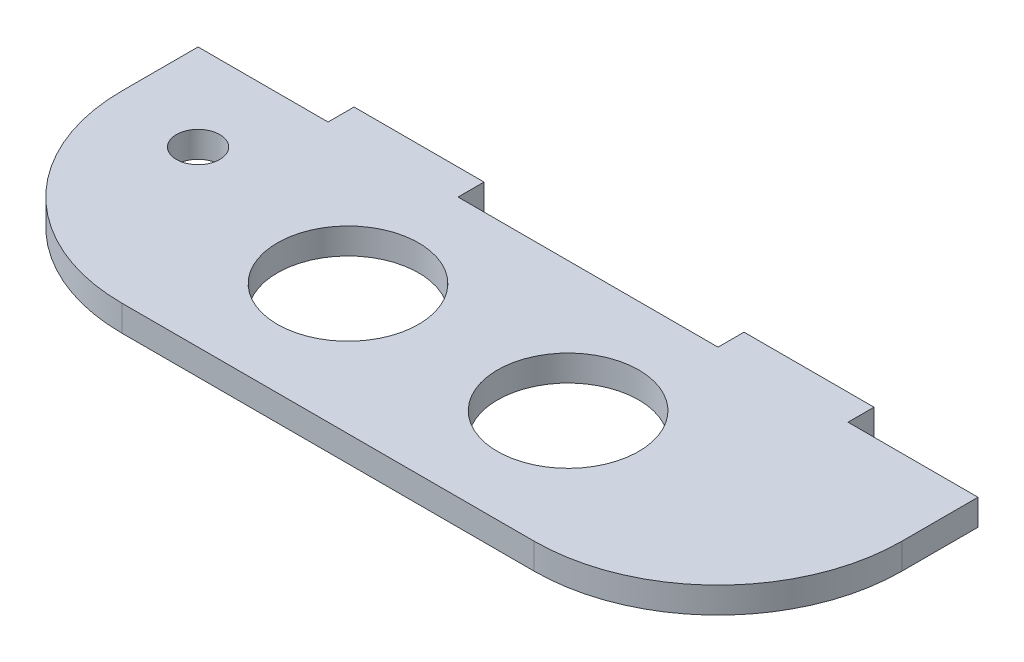
ISO-10303-21;
HEADER;
FILE_DESCRIPTION(('STEP AP214'),'2;1');
FILE_NAME('part.step','',(''),(''),'','','');
FILE_SCHEMA(('AUTOMOTIVE_DESIGN { 1 0 10303 214 1 1 1 1 }'));
ENDSEC;
DATA;
#1=APPLICATION_CONTEXT('core data for automotive mechanical design processes');
#2=APPLICATION_PROTOCOL_DEFINITION('international standard','automotive_design',2000,#1);
#3=PRODUCT_CONTEXT('',#1,'mechanical');
#4=PRODUCT('Part','Part','',(#3));
#5=PRODUCT_RELATED_PRODUCT_CATEGORY('part','',(#4));
#6=PRODUCT_DEFINITION_FORMATION('','',#4);
#7=PRODUCT_DEFINITION_CONTEXT('part definition',#1,'design');
#8=PRODUCT_DEFINITION('design','',#6,#7);
#9=PRODUCT_DEFINITION_SHAPE('','',#8);
#10=(LENGTH_UNIT() NAMED_UNIT(*) SI_UNIT(.MILLI.,.METRE.));
#11=(NAMED_UNIT(*) PLANE_ANGLE_UNIT() SI_UNIT($,.RADIAN.));
#12=(NAMED_UNIT(*) SI_UNIT($,.STERADIAN.) SOLID_ANGLE_UNIT());
#13=UNCERTAINTY_MEASURE_WITH_UNIT(LENGTH_MEASURE(1.E-05),#10,'distance_accuracy_value','');
#14=(GEOMETRIC_REPRESENTATION_CONTEXT(3) GLOBAL_UNCERTAINTY_ASSIGNED_CONTEXT((#13)) GLOBAL_UNIT_ASSIGNED_CONTEXT((#10,
#11,#12)) REPRESENTATION_CONTEXT('',''));
#15=CARTESIAN_POINT('',(0.,0.,0.));
#16=DIRECTION('',(0.,0.,1.));
#17=DIRECTION('',(1.,0.,0.));
#18=AXIS2_PLACEMENT_3D('',#15,#16,#17);
#19=CARTESIAN_POINT('',(-45.,3.,15.));
#20=DIRECTION('',(0.,0.,-1.));
#21=DIRECTION('',(-1.,0.,0.));
#22=AXIS2_PLACEMENT_3D('',#19,#20,#21);
#23=PLANE('',#22);
#24=DIRECTION('',(0.,1.,0.));
#25=VECTOR('',#24,1.);
#26=CARTESIAN_POINT('',(-23.7867965644036,-7.,15.));
#27=LINE('',#26,#25);
#28=CARTESIAN_POINT('',(-23.7867965644036,0.,15.));
#29=VERTEX_POINT('',#28);
#30=CARTESIAN_POINT('',(-23.7867965644036,3.,15.));
#31=VERTEX_POINT('',#30);
#32=EDGE_CURVE('E147',#29,#31,#27,.T.);
#33=ORIENTED_EDGE('',*,*,#32,.F.);
#34=DIRECTION('',(1.,0.,0.));
#35=VECTOR('',#34,1.);
#36=CARTESIAN_POINT('',(-45.,0.,15.));
#37=LINE('',#36,#35);
#38=CARTESIAN_POINT('',(23.7867965644036,0.,15.));
#39=VERTEX_POINT('',#38);
#40=EDGE_CURVE('E198',#29,#39,#37,.T.);
#41=ORIENTED_EDGE('',*,*,#40,.T.);
#42=DIRECTION('',(0.,1.,0.));
#43=VECTOR('',#42,1.);
#44=CARTESIAN_POINT('',(23.7867965644035,-7.,15.));
#45=LINE('',#44,#43);
#46=CARTESIAN_POINT('',(23.7867965644035,3.,15.));
#47=VERTEX_POINT('',#46);
#48=EDGE_CURVE('E68',#39,#47,#45,.T.);
#49=ORIENTED_EDGE('',*,*,#48,.T.);
#50=DIRECTION('',(1.,0.,0.));
#51=VECTOR('',#50,1.);
#52=CARTESIAN_POINT('',(-45.,3.,15.));
#53=LINE('',#52,#51);
#54=EDGE_CURVE('E167',#31,#47,#53,.T.);
#55=ORIENTED_EDGE('',*,*,#54,.F.);
#56=EDGE_LOOP('',(#33,#41,#49,#55));
#57=FACE_BOUND('',#56,.T.);
#58=ADVANCED_FACE('F46',(#57),#23,.F.);
#59=CARTESIAN_POINT('',(0.,3.,0.));
#60=DIRECTION('',(0.,-1.,0.));
#61=DIRECTION('',(0.,0.,-1.));
#62=AXIS2_PLACEMENT_3D('',#59,#60,#61);
#63=PLANE('',#62);
#64=CARTESIAN_POINT('',(-23.7867965644036,3.,-6.21320343559642));
#65=DIRECTION('',(0.,1.,0.));
#66=DIRECTION('',(0.,0.,1.));
#67=AXIS2_PLACEMENT_3D('',#64,#65,#66);
#68=CIRCLE('',#67,21.2132034355964);
#69=CARTESIAN_POINT('',(-45.,3.,-6.21320343559642));
#70=VERTEX_POINT('',#69);
#71=EDGE_CURVE('E144',#70,#31,#68,.T.);
#72=ORIENTED_EDGE('',*,*,#71,.T.);
#73=ORIENTED_EDGE('',*,*,#54,.T.);
#74=CARTESIAN_POINT('',(23.7867965644036,3.,-6.2132034355964));
#75=DIRECTION('',(0.,1.,0.));
#76=DIRECTION('',(0.,0.,1.));
#77=AXIS2_PLACEMENT_3D('',#74,#75,#76);
#78=CIRCLE('',#77,21.2132034355964);
#79=CARTESIAN_POINT('',(45.,3.,-6.21320343559638));
#80=VERTEX_POINT('',#79);
#81=EDGE_CURVE('E247',#80,#47,#78,.F.);
#82=ORIENTED_EDGE('',*,*,#81,.F.);
#83=DIRECTION('',(0.,0.,-1.));
#84=VECTOR('',#83,1.);
#85=CARTESIAN_POINT('',(45.,3.,15.));
#86=LINE('',#85,#84);
#87=CARTESIAN_POINT('',(45.,3.,-15.));
#88=VERTEX_POINT('',#87);
#89=EDGE_CURVE('E169',#80,#88,#86,.T.);
#90=ORIENTED_EDGE('',*,*,#89,.T.);
#91=DIRECTION('',(-1.,0.,0.));
#92=VECTOR('',#91,1.);
#93=CARTESIAN_POINT('',(45.,3.,-15.));
#94=LINE('',#93,#92);
#95=CARTESIAN_POINT('',(30.,3.,-15.));
#96=VERTEX_POINT('',#95);
#97=EDGE_CURVE('E203',#88,#96,#94,.T.);
#98=ORIENTED_EDGE('',*,*,#97,.T.);
#99=DIRECTION('',(0.,0.,-1.));
#100=VECTOR('',#99,1.);
#101=CARTESIAN_POINT('',(30.,3.,-15.));
#102=LINE('',#101,#100);
#103=CARTESIAN_POINT('',(30.,3.,-18.));
#104=VERTEX_POINT('',#103);
#105=EDGE_CURVE('E256',#96,#104,#102,.T.);
#106=ORIENTED_EDGE('',*,*,#105,.T.);
#107=DIRECTION('',(-1.,0.,0.));
#108=VECTOR('',#107,1.);
#109=CARTESIAN_POINT('',(30.,3.,-18.));
#110=LINE('',#109,#108);
#111=CARTESIAN_POINT('',(15.,3.,-18.));
#112=VERTEX_POINT('',#111);
#113=EDGE_CURVE('E258',#104,#112,#110,.T.);
#114=ORIENTED_EDGE('',*,*,#113,.T.);
#115=DIRECTION('',(0.,0.,1.));
#116=VECTOR('',#115,1.);
#117=CARTESIAN_POINT('',(15.,3.,-18.));
#118=LINE('',#117,#116);
#119=CARTESIAN_POINT('',(15.,3.,-15.));
#120=VERTEX_POINT('',#119);
#121=EDGE_CURVE('E264',#112,#120,#118,.T.);
#122=ORIENTED_EDGE('',*,*,#121,.T.);
#123=DIRECTION('',(-1.,0.,0.));
#124=VECTOR('',#123,1.);
#125=CARTESIAN_POINT('',(-15.,3.,-15.));
#126=LINE('',#125,#124);
#127=CARTESIAN_POINT('',(-15.,3.,-15.));
#128=VERTEX_POINT('',#127);
#129=EDGE_CURVE('E266',#120,#128,#126,.T.);
#130=ORIENTED_EDGE('',*,*,#129,.T.);
#131=DIRECTION('',(0.,0.,-1.));
#132=VECTOR('',#131,1.);
#133=CARTESIAN_POINT('',(-15.,3.,-18.));
#134=LINE('',#133,#132);
#135=CARTESIAN_POINT('',(-15.,3.,-18.));
#136=VERTEX_POINT('',#135);
#137=EDGE_CURVE('E268',#128,#136,#134,.T.);
#138=ORIENTED_EDGE('',*,*,#137,.T.);
#139=DIRECTION('',(-1.,0.,0.));
#140=VECTOR('',#139,1.);
#141=CARTESIAN_POINT('',(-30.,3.,-18.));
#142=LINE('',#141,#140);
#143=CARTESIAN_POINT('',(-30.,3.,-18.));
#144=VERTEX_POINT('',#143);
#145=EDGE_CURVE('E270',#136,#144,#142,.T.);
#146=ORIENTED_EDGE('',*,*,#145,.T.);
#147=DIRECTION('',(0.,0.,1.));
#148=VECTOR('',#147,1.);
#149=CARTESIAN_POINT('',(-30.,3.,-15.));
#150=LINE('',#149,#148);
#151=CARTESIAN_POINT('',(-30.,3.,-15.));
#152=VERTEX_POINT('',#151);
#153=EDGE_CURVE('E171',#144,#152,#150,.T.);
#154=ORIENTED_EDGE('',*,*,#153,.T.);
#155=DIRECTION('',(-1.,0.,0.));
#156=VECTOR('',#155,1.);
#157=CARTESIAN_POINT('',(-45.,3.,-15.));
#158=LINE('',#157,#156);
#159=CARTESIAN_POINT('',(-45.,3.,-15.));
#160=VERTEX_POINT('',#159);
#161=EDGE_CURVE('E165',#152,#160,#158,.T.);
#162=ORIENTED_EDGE('',*,*,#161,.T.);
#163=DIRECTION('',(0.,0.,1.));
#164=VECTOR('',#163,1.);
#165=CARTESIAN_POINT('',(-45.,3.,15.));
#166=LINE('',#165,#164);
#167=EDGE_CURVE('E158',#160,#70,#166,.T.);
#168=ORIENTED_EDGE('',*,*,#167,.T.);
#169=EDGE_LOOP('',(#72,#73,#82,#90,#98,#106,#114,#122,#130,#138,#146,#154,#162,#168));
#170=FACE_BOUND('',#169,.T.);
#171=CARTESIAN_POINT('',(-35.,3.,-4.99999999999999));
#172=DIRECTION('',(0.,1.,0.));
#173=DIRECTION('',(0.,0.,1.));
#174=AXIS2_PLACEMENT_3D('',#171,#172,#173);
#175=CIRCLE('',#174,2.5);
#176=CARTESIAN_POINT('',(-35.,3.,-2.49999999999999));
#177=VERTEX_POINT('',#176);
#178=EDGE_CURVE('E235',#177,#177,#175,.T.);
#179=ORIENTED_EDGE('',*,*,#178,.F.);
#180=EDGE_LOOP('',(#179));
#181=FACE_BOUND('',#180,.T.);
#182=CARTESIAN_POINT('',(-12.7,3.,0.));
#183=DIRECTION('',(0.,1.,0.));
#184=DIRECTION('',(0.,0.,1.));
#185=AXIS2_PLACEMENT_3D('',#182,#183,#184);
#186=CIRCLE('',#185,8.15);
#187=CARTESIAN_POINT('',(-12.7,3.,8.15));
#188=VERTEX_POINT('',#187);
#189=EDGE_CURVE('E181',#188,#188,#186,.T.);
#190=ORIENTED_EDGE('',*,*,#189,.F.);
#191=EDGE_LOOP('',(#190));
#192=FACE_BOUND('',#191,.T.);
#193=CARTESIAN_POINT('',(12.7,3.,0.));
#194=DIRECTION('',(0.,1.,0.));
#195=DIRECTION('',(0.,0.,-1.));
#196=AXIS2_PLACEMENT_3D('',#193,#194,#195);
#197=CIRCLE('',#196,8.15);
#198=CARTESIAN_POINT('',(12.7,3.,-8.14999999999995));
#199=VERTEX_POINT('',#198);
#200=EDGE_CURVE('E292',#199,#199,#197,.T.);
#201=ORIENTED_EDGE('',*,*,#200,.F.);
#202=EDGE_LOOP('',(#201));
#203=FACE_BOUND('',#202,.T.);
#204=ADVANCED_FACE('F162',(#170,#181,#192,#203),#63,.F.);
#205=CARTESIAN_POINT('',(0.,0.,0.));
#206=DIRECTION('',(0.,-1.,0.));
#207=DIRECTION('',(0.,0.,-1.));
#208=AXIS2_PLACEMENT_3D('',#205,#206,#207);
#209=PLANE('',#208);
#210=CARTESIAN_POINT('',(12.7,0.,0.));
#211=DIRECTION('',(0.,1.,0.));
#212=DIRECTION('',(0.,0.,-1.));
#213=AXIS2_PLACEMENT_3D('',#210,#211,#212);
#214=CIRCLE('',#213,8.15);
#215=CARTESIAN_POINT('',(12.7,0.,-8.14999999999995));
#216=VERTEX_POINT('',#215);
#217=EDGE_CURVE('E234',#216,#216,#214,.T.);
#218=ORIENTED_EDGE('',*,*,#217,.T.);
#219=EDGE_LOOP('',(#218));
#220=FACE_BOUND('',#219,.T.);
#221=CARTESIAN_POINT('',(-12.7,0.,0.));
#222=DIRECTION('',(0.,1.,0.));
#223=DIRECTION('',(0.,0.,1.));
#224=AXIS2_PLACEMENT_3D('',#221,#222,#223);
#225=CIRCLE('',#224,8.15);
#226=CARTESIAN_POINT('',(-12.7,0.,8.15));
#227=VERTEX_POINT('',#226);
#228=EDGE_CURVE('E290',#227,#227,#225,.T.);
#229=ORIENTED_EDGE('',*,*,#228,.T.);
#230=EDGE_LOOP('',(#229));
#231=FACE_BOUND('',#230,.T.);
#232=CARTESIAN_POINT('',(-35.,0.,-4.99999999999999));
#233=DIRECTION('',(0.,-1.,0.));
#234=DIRECTION('',(0.,0.,-1.));
#235=AXIS2_PLACEMENT_3D('',#232,#233,#234);
#236=CIRCLE('',#235,2.5);
#237=CARTESIAN_POINT('',(-35.,0.,-7.5));
#238=VERTEX_POINT('',#237);
#239=EDGE_CURVE('E232',#238,#238,#236,.T.);
#240=ORIENTED_EDGE('',*,*,#239,.F.);
#241=EDGE_LOOP('',(#240));
#242=FACE_BOUND('',#241,.T.);
#243=ORIENTED_EDGE('',*,*,#40,.F.);
#244=CARTESIAN_POINT('',(-23.7867965644036,0.,-6.21320343559642));
#245=DIRECTION('',(0.,-1.,0.));
#246=DIRECTION('',(0.,0.,-1.));
#247=AXIS2_PLACEMENT_3D('',#244,#245,#246);
#248=CIRCLE('',#247,21.2132034355964);
#249=CARTESIAN_POINT('',(-45.,0.,-6.21320343559642));
#250=VERTEX_POINT('',#249);
#251=EDGE_CURVE('E13',#29,#250,#248,.T.);
#252=ORIENTED_EDGE('',*,*,#251,.T.);
#253=DIRECTION('',(0.,0.,1.));
#254=VECTOR('',#253,1.);
#255=CARTESIAN_POINT('',(-45.,0.,15.));
#256=LINE('',#255,#254);
#257=CARTESIAN_POINT('',(-45.,0.,-15.));
#258=VERTEX_POINT('',#257);
#259=EDGE_CURVE('E160',#258,#250,#256,.T.);
#260=ORIENTED_EDGE('',*,*,#259,.F.);
#261=DIRECTION('',(-1.,0.,0.));
#262=VECTOR('',#261,1.);
#263=CARTESIAN_POINT('',(-45.,0.,-15.));
#264=LINE('',#263,#262);
#265=CARTESIAN_POINT('',(-30.,0.,-15.));
#266=VERTEX_POINT('',#265);
#267=EDGE_CURVE('E195',#266,#258,#264,.T.);
#268=ORIENTED_EDGE('',*,*,#267,.F.);
#269=DIRECTION('',(0.,0.,1.));
#270=VECTOR('',#269,1.);
#271=CARTESIAN_POINT('',(-30.,0.,-15.));
#272=LINE('',#271,#270);
#273=CARTESIAN_POINT('',(-30.,0.,-18.));
#274=VERTEX_POINT('',#273);
#275=EDGE_CURVE('E193',#274,#266,#272,.T.);
#276=ORIENTED_EDGE('',*,*,#275,.F.);
#277=DIRECTION('',(-1.,0.,0.));
#278=VECTOR('',#277,1.);
#279=CARTESIAN_POINT('',(-30.,0.,-18.));
#280=LINE('',#279,#278);
#281=CARTESIAN_POINT('',(-15.,0.,-18.));
#282=VERTEX_POINT('',#281);
#283=EDGE_CURVE('E191',#282,#274,#280,.T.);
#284=ORIENTED_EDGE('',*,*,#283,.F.);
#285=DIRECTION('',(0.,0.,-1.));
#286=VECTOR('',#285,1.);
#287=CARTESIAN_POINT('',(-15.,0.,-18.));
#288=LINE('',#287,#286);
#289=CARTESIAN_POINT('',(-15.,0.,-15.));
#290=VERTEX_POINT('',#289);
#291=EDGE_CURVE('E189',#290,#282,#288,.T.);
#292=ORIENTED_EDGE('',*,*,#291,.F.);
#293=DIRECTION('',(-1.,0.,0.));
#294=VECTOR('',#293,1.);
#295=CARTESIAN_POINT('',(-15.,0.,-15.));
#296=LINE('',#295,#294);
#297=CARTESIAN_POINT('',(15.,0.,-15.));
#298=VERTEX_POINT('',#297);
#299=EDGE_CURVE('E187',#298,#290,#296,.T.);
#300=ORIENTED_EDGE('',*,*,#299,.F.);
#301=DIRECTION('',(0.,0.,1.));
#302=VECTOR('',#301,1.);
#303=CARTESIAN_POINT('',(15.,0.,-18.));
#304=LINE('',#303,#302);
#305=CARTESIAN_POINT('',(15.,0.,-18.));
#306=VERTEX_POINT('',#305);
#307=EDGE_CURVE('E185',#306,#298,#304,.T.);
#308=ORIENTED_EDGE('',*,*,#307,.F.);
#309=DIRECTION('',(-1.,0.,0.));
#310=VECTOR('',#309,1.);
#311=CARTESIAN_POINT('',(30.,0.,-18.));
#312=LINE('',#311,#310);
#313=CARTESIAN_POINT('',(30.,0.,-18.));
#314=VERTEX_POINT('',#313);
#315=EDGE_CURVE('E183',#314,#306,#312,.T.);
#316=ORIENTED_EDGE('',*,*,#315,.F.);
#317=DIRECTION('',(0.,0.,-1.));
#318=VECTOR('',#317,1.);
#319=CARTESIAN_POINT('',(30.,0.,-15.));
#320=LINE('',#319,#318);
#321=CARTESIAN_POINT('',(30.,0.,-15.));
#322=VERTEX_POINT('',#321);
#323=EDGE_CURVE('E180',#322,#314,#320,.T.);
#324=ORIENTED_EDGE('',*,*,#323,.F.);
#325=DIRECTION('',(-1.,0.,0.));
#326=VECTOR('',#325,1.);
#327=CARTESIAN_POINT('',(45.,0.,-15.));
#328=LINE('',#327,#326);
#329=CARTESIAN_POINT('',(45.,0.,-15.));
#330=VERTEX_POINT('',#329);
#331=EDGE_CURVE('E177',#330,#322,#328,.T.);
#332=ORIENTED_EDGE('',*,*,#331,.F.);
#333=DIRECTION('',(0.,0.,-1.));
#334=VECTOR('',#333,1.);
#335=CARTESIAN_POINT('',(45.,0.,15.));
#336=LINE('',#335,#334);
#337=CARTESIAN_POINT('',(45.,0.,-6.21320343559638));
#338=VERTEX_POINT('',#337);
#339=EDGE_CURVE('E201',#338,#330,#336,.T.);
#340=ORIENTED_EDGE('',*,*,#339,.F.);
#341=CARTESIAN_POINT('',(23.7867965644036,0.,-6.2132034355964));
#342=DIRECTION('',(0.,-1.,0.));
#343=DIRECTION('',(0.,0.,-1.));
#344=AXIS2_PLACEMENT_3D('',#341,#342,#343);
#345=CIRCLE('',#344,21.2132034355964);
#346=EDGE_CURVE('E54',#39,#338,#345,.F.);
#347=ORIENTED_EDGE('',*,*,#346,.F.);
#348=EDGE_LOOP('',(#243,#252,#260,#268,#276,#284,#292,#300,#308,#316,#324,#332,#340,#347));
#349=FACE_BOUND('',#348,.T.);
#350=ADVANCED_FACE('F250',(#220,#231,#242,#349),#209,.T.);
#351=CARTESIAN_POINT('',(45.,3.,-15.));
#352=DIRECTION('',(0.,0.,1.));
#353=DIRECTION('',(1.,0.,0.));
#354=AXIS2_PLACEMENT_3D('',#351,#352,#353);
#355=PLANE('',#354);
#356=ORIENTED_EDGE('',*,*,#331,.T.);
#357=DIRECTION('',(0.,-1.,0.));
#358=VECTOR('',#357,1.);
#359=CARTESIAN_POINT('',(30.,3.,-15.));
#360=LINE('',#359,#358);
#361=EDGE_CURVE('E229',#96,#322,#360,.T.);
#362=ORIENTED_EDGE('',*,*,#361,.F.);
#363=ORIENTED_EDGE('',*,*,#97,.F.);
#364=DIRECTION('',(0.,-1.,0.));
#365=VECTOR('',#364,1.);
#366=CARTESIAN_POINT('',(45.,3.,-15.));
#367=LINE('',#366,#365);
#368=EDGE_CURVE('E176',#88,#330,#367,.T.);
#369=ORIENTED_EDGE('',*,*,#368,.T.);
#370=EDGE_LOOP('',(#356,#362,#363,#369));
#371=FACE_BOUND('',#370,.T.);
#372=ADVANCED_FACE('F48',(#371),#355,.F.);
#373=CARTESIAN_POINT('',(30.,3.,-15.));
#374=DIRECTION('',(-1.,0.,0.));
#375=DIRECTION('',(0.,0.,1.));
#376=AXIS2_PLACEMENT_3D('',#373,#374,#375);
#377=PLANE('',#376);
#378=ORIENTED_EDGE('',*,*,#323,.T.);
#379=DIRECTION('',(0.,-1.,0.));
#380=VECTOR('',#379,1.);
#381=CARTESIAN_POINT('',(30.,3.,-18.));
#382=LINE('',#381,#380);
#383=EDGE_CURVE('E226',#104,#314,#382,.T.);
#384=ORIENTED_EDGE('',*,*,#383,.F.);
#385=ORIENTED_EDGE('',*,*,#105,.F.);
#386=ORIENTED_EDGE('',*,*,#361,.T.);
#387=EDGE_LOOP('',(#378,#384,#385,#386));
#388=FACE_BOUND('',#387,.T.);
#389=ADVANCED_FACE('F345',(#388),#377,.F.);
#390=CARTESIAN_POINT('',(30.,3.,-18.));
#391=DIRECTION('',(0.,0.,1.));
#392=DIRECTION('',(1.,0.,0.));
#393=AXIS2_PLACEMENT_3D('',#390,#391,#392);
#394=PLANE('',#393);
#395=ORIENTED_EDGE('',*,*,#315,.T.);
#396=DIRECTION('',(0.,-1.,0.));
#397=VECTOR('',#396,1.);
#398=CARTESIAN_POINT('',(15.,3.,-18.));
#399=LINE('',#398,#397);
#400=EDGE_CURVE('E223',#112,#306,#399,.T.);
#401=ORIENTED_EDGE('',*,*,#400,.F.);
#402=ORIENTED_EDGE('',*,*,#113,.F.);
#403=ORIENTED_EDGE('',*,*,#383,.T.);
#404=EDGE_LOOP('',(#395,#401,#402,#403));
#405=FACE_BOUND('',#404,.T.);
#406=ADVANCED_FACE('F342',(#405),#394,.F.);
#407=CARTESIAN_POINT('',(15.,3.,-18.));
#408=DIRECTION('',(1.,0.,0.));
#409=DIRECTION('',(0.,0.,-1.));
#410=AXIS2_PLACEMENT_3D('',#407,#408,#409);
#411=PLANE('',#410);
#412=ORIENTED_EDGE('',*,*,#307,.T.);
#413=DIRECTION('',(0.,-1.,0.));
#414=VECTOR('',#413,1.);
#415=CARTESIAN_POINT('',(15.,3.,-15.));
#416=LINE('',#415,#414);
#417=EDGE_CURVE('E220',#120,#298,#416,.T.);
#418=ORIENTED_EDGE('',*,*,#417,.F.);
#419=ORIENTED_EDGE('',*,*,#121,.F.);
#420=ORIENTED_EDGE('',*,*,#400,.T.);
#421=EDGE_LOOP('',(#412,#418,#419,#420));
#422=FACE_BOUND('',#421,.T.);
#423=ADVANCED_FACE('F338',(#422),#411,.F.);
#424=CARTESIAN_POINT('',(-15.,3.,-15.));
#425=DIRECTION('',(0.,0.,1.));
#426=DIRECTION('',(1.,0.,0.));
#427=AXIS2_PLACEMENT_3D('',#424,#425,#426);
#428=PLANE('',#427);
#429=ORIENTED_EDGE('',*,*,#299,.T.);
#430=DIRECTION('',(0.,-1.,0.));
#431=VECTOR('',#430,1.);
#432=CARTESIAN_POINT('',(-15.,3.,-15.));
#433=LINE('',#432,#431);
#434=EDGE_CURVE('E217',#128,#290,#433,.T.);
#435=ORIENTED_EDGE('',*,*,#434,.F.);
#436=ORIENTED_EDGE('',*,*,#129,.F.);
#437=ORIENTED_EDGE('',*,*,#417,.T.);
#438=EDGE_LOOP('',(#429,#435,#436,#437));
#439=FACE_BOUND('',#438,.T.);
#440=ADVANCED_FACE('F334',(#439),#428,.F.);
#441=CARTESIAN_POINT('',(-15.,3.,-18.));
#442=DIRECTION('',(-1.,0.,0.));
#443=DIRECTION('',(0.,0.,1.));
#444=AXIS2_PLACEMENT_3D('',#441,#442,#443);
#445=PLANE('',#444);
#446=ORIENTED_EDGE('',*,*,#291,.T.);
#447=DIRECTION('',(0.,-1.,0.));
#448=VECTOR('',#447,1.);
#449=CARTESIAN_POINT('',(-15.,3.,-18.));
#450=LINE('',#449,#448);
#451=EDGE_CURVE('E214',#136,#282,#450,.T.);
#452=ORIENTED_EDGE('',*,*,#451,.F.);
#453=ORIENTED_EDGE('',*,*,#137,.F.);
#454=ORIENTED_EDGE('',*,*,#434,.T.);
#455=EDGE_LOOP('',(#446,#452,#453,#454));
#456=FACE_BOUND('',#455,.T.);
#457=ADVANCED_FACE('F330',(#456),#445,.F.);
#458=CARTESIAN_POINT('',(-30.,3.,-18.));
#459=DIRECTION('',(0.,0.,1.));
#460=DIRECTION('',(1.,0.,0.));
#461=AXIS2_PLACEMENT_3D('',#458,#459,#460);
#462=PLANE('',#461);
#463=ORIENTED_EDGE('',*,*,#283,.T.);
#464=DIRECTION('',(0.,-1.,0.));
#465=VECTOR('',#464,1.);
#466=CARTESIAN_POINT('',(-30.,3.,-18.));
#467=LINE('',#466,#465);
#468=EDGE_CURVE('E211',#144,#274,#467,.T.);
#469=ORIENTED_EDGE('',*,*,#468,.F.);
#470=ORIENTED_EDGE('',*,*,#145,.F.);
#471=ORIENTED_EDGE('',*,*,#451,.T.);
#472=EDGE_LOOP('',(#463,#469,#470,#471));
#473=FACE_BOUND('',#472,.T.);
#474=ADVANCED_FACE('F327',(#473),#462,.F.);
#475=CARTESIAN_POINT('',(-30.,3.,-15.));
#476=DIRECTION('',(1.,0.,0.));
#477=DIRECTION('',(0.,0.,-1.));
#478=AXIS2_PLACEMENT_3D('',#475,#476,#477);
#479=PLANE('',#478);
#480=ORIENTED_EDGE('',*,*,#275,.T.);
#481=DIRECTION('',(0.,-1.,0.));
#482=VECTOR('',#481,1.);
#483=CARTESIAN_POINT('',(-30.,3.,-15.));
#484=LINE('',#483,#482);
#485=EDGE_CURVE('E208',#152,#266,#484,.T.);
#486=ORIENTED_EDGE('',*,*,#485,.F.);
#487=ORIENTED_EDGE('',*,*,#153,.F.);
#488=ORIENTED_EDGE('',*,*,#468,.T.);
#489=EDGE_LOOP('',(#480,#486,#487,#488));
#490=FACE_BOUND('',#489,.T.);
#491=ADVANCED_FACE('F276',(#490),#479,.F.);
#492=CARTESIAN_POINT('',(-45.,3.,-15.));
#493=DIRECTION('',(0.,0.,1.));
#494=DIRECTION('',(1.,0.,0.));
#495=AXIS2_PLACEMENT_3D('',#492,#493,#494);
#496=PLANE('',#495);
#497=ORIENTED_EDGE('',*,*,#267,.T.);
#498=DIRECTION('',(0.,-1.,0.));
#499=VECTOR('',#498,1.);
#500=CARTESIAN_POINT('',(-45.,3.,-15.));
#501=LINE('',#500,#499);
#502=EDGE_CURVE('E206',#160,#258,#501,.T.);
#503=ORIENTED_EDGE('',*,*,#502,.F.);
#504=ORIENTED_EDGE('',*,*,#161,.F.);
#505=ORIENTED_EDGE('',*,*,#485,.T.);
#506=EDGE_LOOP('',(#497,#503,#504,#505));
#507=FACE_BOUND('',#506,.T.);
#508=ADVANCED_FACE('F280',(#507),#496,.F.);
#509=CARTESIAN_POINT('',(-45.,3.,15.));
#510=DIRECTION('',(1.,0.,0.));
#511=DIRECTION('',(0.,0.,-1.));
#512=AXIS2_PLACEMENT_3D('',#509,#510,#511);
#513=PLANE('',#512);
#514=ORIENTED_EDGE('',*,*,#259,.T.);
#515=DIRECTION('',(0.,1.,0.));
#516=VECTOR('',#515,1.);
#517=CARTESIAN_POINT('',(-45.,-7.,-6.21320343559642));
#518=LINE('',#517,#516);
#519=EDGE_CURVE('E61',#250,#70,#518,.T.);
#520=ORIENTED_EDGE('',*,*,#519,.T.);
#521=ORIENTED_EDGE('',*,*,#167,.F.);
#522=ORIENTED_EDGE('',*,*,#502,.T.);
#523=EDGE_LOOP('',(#514,#520,#521,#522));
#524=FACE_BOUND('',#523,.T.);
#525=ADVANCED_FACE('F156',(#524),#513,.F.);
#526=CARTESIAN_POINT('',(45.,3.,15.));
#527=DIRECTION('',(-1.,0.,0.));
#528=DIRECTION('',(0.,0.,1.));
#529=AXIS2_PLACEMENT_3D('',#526,#527,#528);
#530=PLANE('',#529);
#531=ORIENTED_EDGE('',*,*,#89,.F.);
#532=DIRECTION('',(0.,1.,0.));
#533=VECTOR('',#532,1.);
#534=CARTESIAN_POINT('',(45.,-7.,-6.21320343559638));
#535=LINE('',#534,#533);
#536=EDGE_CURVE('E238',#338,#80,#535,.T.);
#537=ORIENTED_EDGE('',*,*,#536,.F.);
#538=ORIENTED_EDGE('',*,*,#339,.T.);
#539=ORIENTED_EDGE('',*,*,#368,.F.);
#540=EDGE_LOOP('',(#531,#537,#538,#539));
#541=FACE_BOUND('',#540,.T.);
#542=ADVANCED_FACE('F245',(#541),#530,.F.);
#543=CARTESIAN_POINT('',(12.7,3.,0.));
#544=DIRECTION('',(0.,-1.,0.));
#545=DIRECTION('',(0.,0.,-1.));
#546=AXIS2_PLACEMENT_3D('',#543,#544,#545);
#547=CYLINDRICAL_SURFACE('',#546,8.15);
#548=ORIENTED_EDGE('',*,*,#200,.T.);
#549=EDGE_LOOP('',(#548));
#550=FACE_BOUND('',#549,.T.);
#551=ORIENTED_EDGE('',*,*,#217,.F.);
#552=EDGE_LOOP('',(#551));
#553=FACE_BOUND('',#552,.T.);
#554=ADVANCED_FACE('F301',(#550,#553),#547,.F.);
#555=CARTESIAN_POINT('',(-12.7,3.,0.));
#556=DIRECTION('',(0.,-1.,0.));
#557=DIRECTION('',(0.,0.,-1.));
#558=AXIS2_PLACEMENT_3D('',#555,#556,#557);
#559=CYLINDRICAL_SURFACE('',#558,8.15);
#560=ORIENTED_EDGE('',*,*,#189,.T.);
#561=EDGE_LOOP('',(#560));
#562=FACE_BOUND('',#561,.T.);
#563=ORIENTED_EDGE('',*,*,#228,.F.);
#564=EDGE_LOOP('',(#563));
#565=FACE_BOUND('',#564,.T.);
#566=ADVANCED_FACE('F303',(#562,#565),#559,.F.);
#567=CARTESIAN_POINT('',(-35.,-7.,-4.99999999999999));
#568=DIRECTION('',(0.,1.,0.));
#569=DIRECTION('',(0.,0.,1.));
#570=AXIS2_PLACEMENT_3D('',#567,#568,#569);
#571=CYLINDRICAL_SURFACE('',#570,2.5);
#572=ORIENTED_EDGE('',*,*,#239,.T.);
#573=EDGE_LOOP('',(#572));
#574=FACE_BOUND('',#573,.T.);
#575=ORIENTED_EDGE('',*,*,#178,.T.);
#576=EDGE_LOOP('',(#575));
#577=FACE_BOUND('',#576,.T.);
#578=ADVANCED_FACE('F309',(#574,#577),#571,.F.);
#579=CARTESIAN_POINT('',(23.7867965644036,-7.,-6.2132034355964));
#580=DIRECTION('',(0.,1.,0.));
#581=DIRECTION('',(0.,0.,1.));
#582=AXIS2_PLACEMENT_3D('',#579,#580,#581);
#583=CYLINDRICAL_SURFACE('',#582,21.2132034355964);
#584=ORIENTED_EDGE('',*,*,#346,.T.);
#585=ORIENTED_EDGE('',*,*,#536,.T.);
#586=ORIENTED_EDGE('',*,*,#81,.T.);
#587=ORIENTED_EDGE('',*,*,#48,.F.);
#588=EDGE_LOOP('',(#584,#585,#586,#587));
#589=FACE_BOUND('',#588,.T.);
#590=ADVANCED_FACE('F237',(#589),#583,.T.);
#591=CARTESIAN_POINT('',(-23.7867965644036,-7.,-6.21320343559642));
#592=DIRECTION('',(0.,1.,0.));
#593=DIRECTION('',(0.,0.,1.));
#594=AXIS2_PLACEMENT_3D('',#591,#592,#593);
#595=CYLINDRICAL_SURFACE('',#594,21.2132034355964);
#596=ORIENTED_EDGE('',*,*,#32,.T.);
#597=ORIENTED_EDGE('',*,*,#71,.F.);
#598=ORIENTED_EDGE('',*,*,#519,.F.);
#599=ORIENTED_EDGE('',*,*,#251,.F.);
#600=EDGE_LOOP('',(#596,#597,#598,#599));
#601=FACE_BOUND('',#600,.T.);
#602=ADVANCED_FACE('F145',(#601),#595,.T.);
#603=CLOSED_SHELL('',(#58,#204,#350,#372,#389,#406,#423,#440,#457,#474,#491,#508,#525,#542,#554,
#566,#578,#590,#602));
#604=MANIFOLD_SOLID_BREP('B2',#603);
#605=ADVANCED_BREP_SHAPE_REPRESENTATION('',(#18,#604),#14);
#606=SHAPE_DEFINITION_REPRESENTATION(#9,#605);
ENDSEC;
END-ISO-10303-21;
